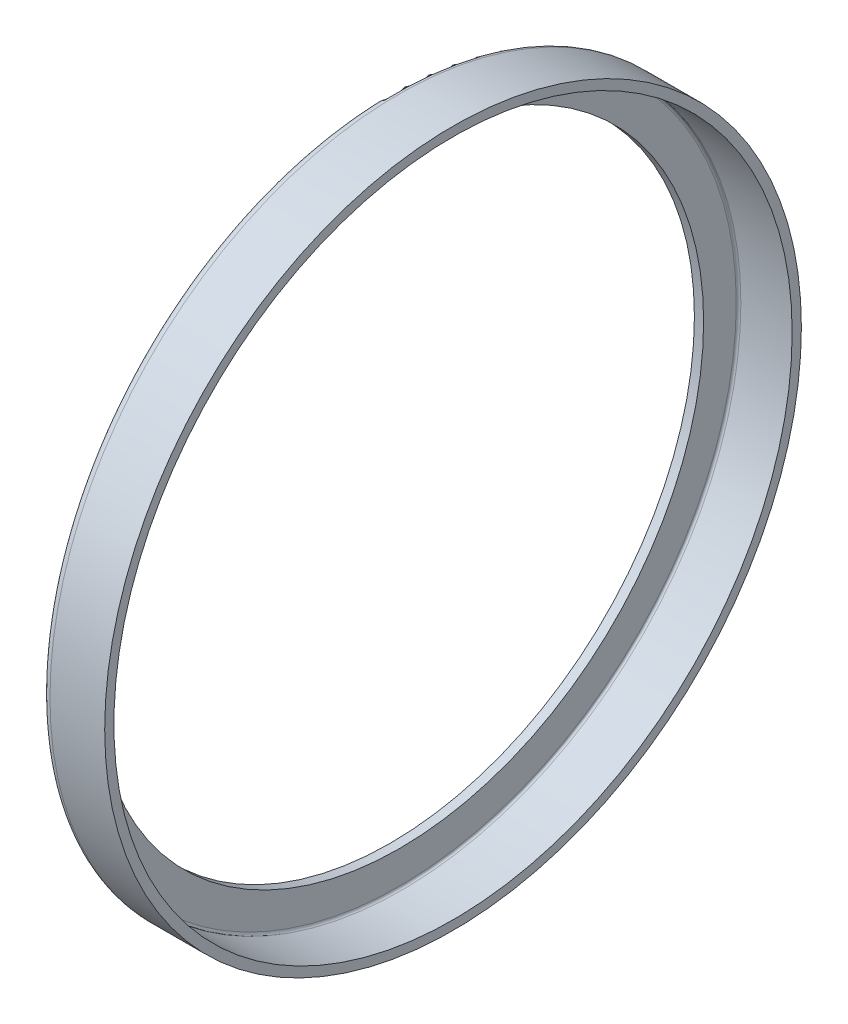
ISO-10303-21;
HEADER;
FILE_DESCRIPTION(('STEP AP214'),'2;1');
FILE_NAME('part.step','',(''),(''),'','','');
FILE_SCHEMA(('AUTOMOTIVE_DESIGN { 1 0 10303 214 1 1 1 1 }'));
ENDSEC;
DATA;
#1=APPLICATION_CONTEXT('core data for automotive mechanical design processes');
#2=APPLICATION_PROTOCOL_DEFINITION('international standard','automotive_design',2000,#1);
#3=PRODUCT_CONTEXT('',#1,'mechanical');
#4=PRODUCT('Part','Part','',(#3));
#5=PRODUCT_RELATED_PRODUCT_CATEGORY('part','',(#4));
#6=PRODUCT_DEFINITION_FORMATION('','',#4);
#7=PRODUCT_DEFINITION_CONTEXT('part definition',#1,'design');
#8=PRODUCT_DEFINITION('design','',#6,#7);
#9=PRODUCT_DEFINITION_SHAPE('','',#8);
#10=(LENGTH_UNIT() NAMED_UNIT(*) SI_UNIT(.MILLI.,.METRE.));
#11=(NAMED_UNIT(*) PLANE_ANGLE_UNIT() SI_UNIT($,.RADIAN.));
#12=(NAMED_UNIT(*) SI_UNIT($,.STERADIAN.) SOLID_ANGLE_UNIT());
#13=UNCERTAINTY_MEASURE_WITH_UNIT(LENGTH_MEASURE(1.E-05),#10,'distance_accuracy_value','');
#14=(GEOMETRIC_REPRESENTATION_CONTEXT(3) GLOBAL_UNCERTAINTY_ASSIGNED_CONTEXT((#13)) GLOBAL_UNIT_ASSIGNED_CONTEXT((#10,
#11,#12)) REPRESENTATION_CONTEXT('',''));
#15=CARTESIAN_POINT('',(0.,0.,0.));
#16=DIRECTION('',(0.,0.,1.));
#17=DIRECTION('',(1.,0.,0.));
#18=AXIS2_PLACEMENT_3D('',#15,#16,#17);
#19=CARTESIAN_POINT('',(1.30280772000007,0.,0.));
#20=DIRECTION('',(1.,0.,0.));
#21=DIRECTION('',(0.,0.,-1.));
#22=AXIS2_PLACEMENT_3D('',#19,#20,#21);
#23=TOROIDAL_SURFACE('',#22,29.8071922799999,0.710500000000076);
#24=CARTESIAN_POINT('',(0.59230772,0.,0.));
#25=DIRECTION('',(1.,0.,0.));
#26=DIRECTION('',(0.,0.,-1.));
#27=AXIS2_PLACEMENT_3D('',#24,#25,#26);
#28=CIRCLE('',#27,29.807192335013);
#29=CARTESIAN_POINT('',(0.59230772,0.,-29.807192335013));
#30=VERTEX_POINT('',#29);
#31=EDGE_CURVE('E44',#30,#30,#28,.T.);
#32=ORIENTED_EDGE('',*,*,#31,.T.);
#33=EDGE_LOOP('',(#32));
#34=FACE_BOUND('',#33,.T.);
#35=CARTESIAN_POINT('',(1.30280772,0.,0.));
#36=DIRECTION('',(1.,0.,0.));
#37=DIRECTION('',(0.,0.,-1.));
#38=AXIS2_PLACEMENT_3D('',#35,#36,#37);
#39=CIRCLE('',#38,30.51769228);
#40=CARTESIAN_POINT('',(1.30280772,0.,-30.51769228));
#41=VERTEX_POINT('',#40);
#42=EDGE_CURVE('E41',#41,#41,#39,.T.);
#43=ORIENTED_EDGE('',*,*,#42,.F.);
#44=EDGE_LOOP('',(#43));
#45=FACE_BOUND('',#44,.T.);
#46=ADVANCED_FACE('F15',(#34,#45),#23,.T.);
#47=CARTESIAN_POINT('',(0.59230772,29.80719228,0.));
#48=DIRECTION('',(-1.,0.,0.));
#49=DIRECTION('',(0.,0.,1.));
#50=AXIS2_PLACEMENT_3D('',#47,#48,#49);
#51=PLANE('',#50);
#52=CARTESIAN_POINT('',(0.59230772,0.,0.));
#53=DIRECTION('',(1.,0.,0.));
#54=DIRECTION('',(0.,0.,-1.));
#55=AXIS2_PLACEMENT_3D('',#52,#53,#54);
#56=CIRCLE('',#55,26.65);
#57=CARTESIAN_POINT('',(0.59230772,0.,-26.65));
#58=VERTEX_POINT('',#57);
#59=EDGE_CURVE('E38',#58,#58,#56,.T.);
#60=ORIENTED_EDGE('',*,*,#59,.T.);
#61=EDGE_LOOP('',(#60));
#62=FACE_BOUND('',#61,.T.);
#63=ORIENTED_EDGE('',*,*,#31,.F.);
#64=EDGE_LOOP('',(#63));
#65=FACE_BOUND('',#64,.T.);
#66=ADVANCED_FACE('F50',(#62,#65),#51,.T.);
#67=CARTESIAN_POINT('',(7.,0.,0.));
#68=DIRECTION('',(1.,0.,0.));
#69=DIRECTION('',(0.,0.,-1.));
#70=AXIS2_PLACEMENT_3D('',#67,#68,#69);
#71=CYLINDRICAL_SURFACE('',#70,30.51769228);
#72=ORIENTED_EDGE('',*,*,#42,.T.);
#73=EDGE_LOOP('',(#72));
#74=FACE_BOUND('',#73,.T.);
#75=CARTESIAN_POINT('',(6.097,0.,0.));
#76=DIRECTION('',(1.,0.,0.));
#77=DIRECTION('',(0.,0.,-1.));
#78=AXIS2_PLACEMENT_3D('',#75,#76,#77);
#79=CIRCLE('',#78,30.51769228);
#80=CARTESIAN_POINT('',(6.097,0.,-30.51769228));
#81=VERTEX_POINT('',#80);
#82=EDGE_CURVE('E35',#81,#81,#79,.T.);
#83=ORIENTED_EDGE('',*,*,#82,.F.);
#84=EDGE_LOOP('',(#83));
#85=FACE_BOUND('',#84,.T.);
#86=ADVANCED_FACE('F52',(#74,#85),#71,.T.);
#87=CARTESIAN_POINT('',(7.,0.,0.));
#88=DIRECTION('',(1.,0.,0.));
#89=DIRECTION('',(0.,0.,-1.));
#90=AXIS2_PLACEMENT_3D('',#87,#88,#89);
#91=CYLINDRICAL_SURFACE('',#90,26.65);
#92=CARTESIAN_POINT('',(1.4,0.,0.));
#93=DIRECTION('',(1.,0.,0.));
#94=DIRECTION('',(0.,0.,-1.));
#95=AXIS2_PLACEMENT_3D('',#92,#93,#94);
#96=CIRCLE('',#95,26.65);
#97=CARTESIAN_POINT('',(1.4,0.,-26.65));
#98=VERTEX_POINT('',#97);
#99=EDGE_CURVE('E30',#98,#98,#96,.T.);
#100=ORIENTED_EDGE('',*,*,#99,.T.);
#101=EDGE_LOOP('',(#100));
#102=FACE_BOUND('',#101,.T.);
#103=ORIENTED_EDGE('',*,*,#59,.F.);
#104=EDGE_LOOP('',(#103));
#105=FACE_BOUND('',#104,.T.);
#106=ADVANCED_FACE('F60',(#102,#105),#91,.F.);
#107=CARTESIAN_POINT('',(6.097,29.71,0.));
#108=DIRECTION('',(1.,0.,0.));
#109=DIRECTION('',(0.,0.,-1.));
#110=AXIS2_PLACEMENT_3D('',#107,#108,#109);
#111=PLANE('',#110);
#112=ORIENTED_EDGE('',*,*,#82,.T.);
#113=EDGE_LOOP('',(#112));
#114=FACE_BOUND('',#113,.T.);
#115=CARTESIAN_POINT('',(6.097,0.,0.));
#116=DIRECTION('',(1.,0.,0.));
#117=DIRECTION('',(0.,0.,-1.));
#118=AXIS2_PLACEMENT_3D('',#115,#116,#117);
#119=CIRCLE('',#118,29.71);
#120=CARTESIAN_POINT('',(6.097,0.,-29.71));
#121=VERTEX_POINT('',#120);
#122=EDGE_CURVE('E26',#121,#121,#119,.T.);
#123=ORIENTED_EDGE('',*,*,#122,.F.);
#124=EDGE_LOOP('',(#123));
#125=FACE_BOUND('',#124,.T.);
#126=ADVANCED_FACE('F67',(#114,#125),#111,.T.);
#127=CARTESIAN_POINT('',(1.4,26.65,0.));
#128=DIRECTION('',(1.,0.,0.));
#129=DIRECTION('',(0.,0.,-1.));
#130=AXIS2_PLACEMENT_3D('',#127,#128,#129);
#131=PLANE('',#130);
#132=CARTESIAN_POINT('',(1.4,0.,0.));
#133=DIRECTION('',(1.,0.,0.));
#134=DIRECTION('',(0.,0.,-1.));
#135=AXIS2_PLACEMENT_3D('',#132,#133,#134);
#136=CIRCLE('',#135,29.5069999828884);
#137=CARTESIAN_POINT('',(1.4,0.,-29.5069999828884));
#138=VERTEX_POINT('',#137);
#139=EDGE_CURVE('E22',#138,#138,#136,.T.);
#140=ORIENTED_EDGE('',*,*,#139,.T.);
#141=EDGE_LOOP('',(#140));
#142=FACE_BOUND('',#141,.T.);
#143=ORIENTED_EDGE('',*,*,#99,.F.);
#144=EDGE_LOOP('',(#143));
#145=FACE_BOUND('',#144,.T.);
#146=ADVANCED_FACE('F71',(#142,#145),#131,.T.);
#147=CARTESIAN_POINT('',(7.,0.,0.));
#148=DIRECTION('',(1.,0.,0.));
#149=DIRECTION('',(0.,0.,-1.));
#150=AXIS2_PLACEMENT_3D('',#147,#148,#149);
#151=CYLINDRICAL_SURFACE('',#150,29.71);
#152=ORIENTED_EDGE('',*,*,#122,.T.);
#153=EDGE_LOOP('',(#152));
#154=FACE_BOUND('',#153,.T.);
#155=CARTESIAN_POINT('',(1.603,0.,0.));
#156=DIRECTION('',(1.,0.,0.));
#157=DIRECTION('',(0.,0.,-1.));
#158=AXIS2_PLACEMENT_3D('',#155,#156,#157);
#159=CIRCLE('',#158,29.71);
#160=CARTESIAN_POINT('',(1.603,0.,-29.71));
#161=VERTEX_POINT('',#160);
#162=EDGE_CURVE('E10',#161,#161,#159,.T.);
#163=ORIENTED_EDGE('',*,*,#162,.F.);
#164=EDGE_LOOP('',(#163));
#165=FACE_BOUND('',#164,.T.);
#166=ADVANCED_FACE('F74',(#154,#165),#151,.F.);
#167=CARTESIAN_POINT('',(1.60299999999972,0.,0.));
#168=DIRECTION('',(1.,0.,0.));
#169=DIRECTION('',(0.,0.,-1.));
#170=AXIS2_PLACEMENT_3D('',#167,#168,#169);
#171=TOROIDAL_SURFACE('',#170,29.507,0.202999999999721);
#172=ORIENTED_EDGE('',*,*,#139,.F.);
#173=EDGE_LOOP('',(#172));
#174=FACE_BOUND('',#173,.T.);
#175=ORIENTED_EDGE('',*,*,#162,.T.);
#176=EDGE_LOOP('',(#175));
#177=FACE_BOUND('',#176,.T.);
#178=ADVANCED_FACE('F17',(#174,#177),#171,.F.);
#179=CLOSED_SHELL('',(#46,#66,#86,#106,#126,#146,#166,#178));
#180=MANIFOLD_SOLID_BREP('B1',#179);
#181=ADVANCED_BREP_SHAPE_REPRESENTATION('',(#18,#180),#14);
#182=SHAPE_DEFINITION_REPRESENTATION(#9,#181);
ENDSEC;
END-ISO-10303-21;
